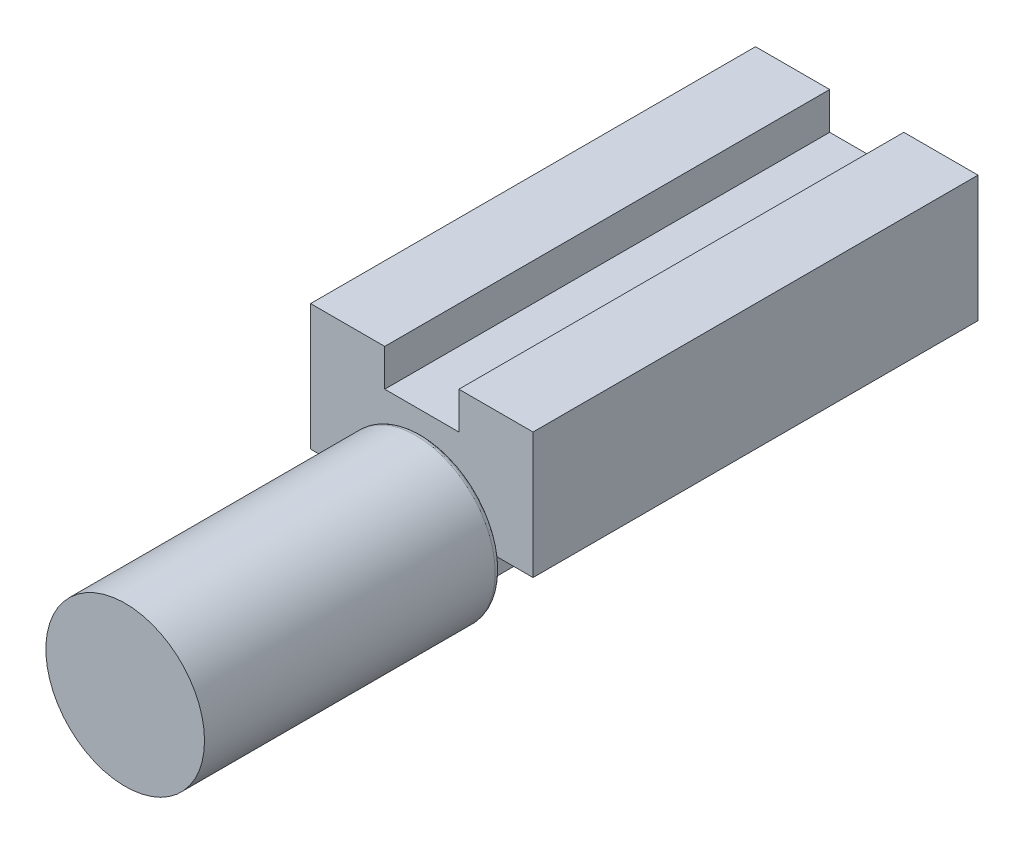
ISO-10303-21;
HEADER;
FILE_DESCRIPTION(('STEP AP214'),'2;1');
FILE_NAME('part.step','',(''),(''),'','','');
FILE_SCHEMA(('AUTOMOTIVE_DESIGN { 1 0 10303 214 1 1 1 1 }'));
ENDSEC;
DATA;
#1=APPLICATION_CONTEXT('core data for automotive mechanical design processes');
#2=APPLICATION_PROTOCOL_DEFINITION('international standard','automotive_design',2000,#1);
#3=PRODUCT_CONTEXT('',#1,'mechanical');
#4=PRODUCT('Part','Part','',(#3));
#5=PRODUCT_RELATED_PRODUCT_CATEGORY('part','',(#4));
#6=PRODUCT_DEFINITION_FORMATION('','',#4);
#7=PRODUCT_DEFINITION_CONTEXT('part definition',#1,'design');
#8=PRODUCT_DEFINITION('design','',#6,#7);
#9=PRODUCT_DEFINITION_SHAPE('','',#8);
#10=(LENGTH_UNIT() NAMED_UNIT(*) SI_UNIT(.MILLI.,.METRE.));
#11=(NAMED_UNIT(*) PLANE_ANGLE_UNIT() SI_UNIT($,.RADIAN.));
#12=(NAMED_UNIT(*) SI_UNIT($,.STERADIAN.) SOLID_ANGLE_UNIT());
#13=UNCERTAINTY_MEASURE_WITH_UNIT(LENGTH_MEASURE(1.E-05),#10,'distance_accuracy_value','');
#14=(GEOMETRIC_REPRESENTATION_CONTEXT(3) GLOBAL_UNCERTAINTY_ASSIGNED_CONTEXT((#13)) GLOBAL_UNIT_ASSIGNED_CONTEXT((#10,
#11,#12)) REPRESENTATION_CONTEXT('',''));
#15=CARTESIAN_POINT('',(0.,0.,0.));
#16=DIRECTION('',(0.,0.,1.));
#17=DIRECTION('',(1.,0.,0.));
#18=AXIS2_PLACEMENT_3D('',#15,#16,#17);
#19=CARTESIAN_POINT('',(-40.9860750000001,-6.15162599999999,25.6413));
#20=DIRECTION('',(0.,0.,1.));
#21=DIRECTION('',(1.,0.,0.));
#22=AXIS2_PLACEMENT_3D('',#19,#20,#21);
#23=PLANE('',#22);
#24=DIRECTION('',(-1.,0.,0.));
#25=VECTOR('',#24,1.);
#26=CARTESIAN_POINT('',(-36.7125250000001,-5.63879999999999,25.6413));
#27=LINE('',#26,#25);
#28=CARTESIAN_POINT('',(-36.7871595606062,-5.63879999999999,25.6413));
#29=VERTEX_POINT('',#28);
#30=CARTESIAN_POINT('',(-45.1849904393939,-5.63879999999999,25.6413));
#31=VERTEX_POINT('',#30);
#32=EDGE_CURVE('E136',#29,#31,#27,.T.);
#33=ORIENTED_EDGE('',*,*,#32,.T.);
#34=CARTESIAN_POINT('',(-40.9860750000001,-6.15162599999999,25.6413));
#35=DIRECTION('',(0.,0.,1.));
#36=DIRECTION('',(1.,0.,0.));
#37=AXIS2_PLACEMENT_3D('',#34,#35,#36);
#38=CIRCLE('',#37,4.230116);
#39=EDGE_CURVE('E157',#31,#29,#38,.F.);
#40=ORIENTED_EDGE('',*,*,#39,.T.);
#41=EDGE_LOOP('',(#33,#40));
#42=FACE_BOUND('',#41,.T.);
#43=ADVANCED_FACE('F60',(#42),#23,.F.);
#44=CARTESIAN_POINT('',(-36.7125250000001,-5.63879999999999,12.82065));
#45=DIRECTION('',(1.,0.,0.));
#46=DIRECTION('',(0.,0.,-1.));
#47=AXIS2_PLACEMENT_3D('',#44,#45,#46);
#48=PLANE('',#47);
#49=DIRECTION('',(0.,0.,1.));
#50=VECTOR('',#49,1.);
#51=CARTESIAN_POINT('',(-36.7125250000001,-5.63879999999999,12.82065));
#52=LINE('',#51,#50);
#53=CARTESIAN_POINT('',(-36.7125250000001,-5.63879999999999,12.82065));
#54=VERTEX_POINT('',#53);
#55=CARTESIAN_POINT('',(-36.7125250000001,-5.63879999999999,25.6494253883431));
#56=VERTEX_POINT('',#55);
#57=EDGE_CURVE('E111',#54,#56,#52,.T.);
#58=ORIENTED_EDGE('',*,*,#57,.T.);
#59=CARTESIAN_POINT('',(-36.7125250000001,-5.63879999999999,25.6494253883431));
#60=CARTESIAN_POINT('',(-36.7125250000001,-5.69577522713636,25.6479450008011));
#61=CARTESIAN_POINT('',(-36.7125250000001,-5.75275822812826,25.6468765231355));
#62=CARTESIAN_POINT('',(-36.7125250000001,-5.86673144202436,25.6453232279782));
#63=CARTESIAN_POINT('',(-36.7125250000001,-5.92372165475941,25.6448383986832));
#64=CARTESIAN_POINT('',(-36.7125250000001,-6.03770612746633,25.6442121844941));
#65=CARTESIAN_POINT('',(-36.7125250000001,-6.0947003874976,25.6440708168729));
#66=CARTESIAN_POINT('',(-36.7125250000001,-6.20868928101538,25.6440696191949));
#67=CARTESIAN_POINT('',(-36.7125250000001,-6.26568391450249,25.6442097899896));
#68=CARTESIAN_POINT('',(-36.7125250000001,-6.35116075014746,25.6446841235827));
#69=CARTESIAN_POINT('',(-36.7125250000001,-6.379643698667,25.6448861678026));
#70=CARTESIAN_POINT('',(-36.7125250000001,-6.43660824210007,25.6454021456277));
#71=CARTESIAN_POINT('',(-36.7125250000001,-6.46508983702641,25.645716077771));
#72=CARTESIAN_POINT('',(-36.7125250000001,-6.52205349929932,25.6464854157013));
#73=CARTESIAN_POINT('',(-36.7125250000001,-6.55053556650011,25.6469408328486));
#74=CARTESIAN_POINT('',(-36.7125250000001,-6.60749664269976,25.6480350717582));
#75=CARTESIAN_POINT('',(-36.7125250000001,-6.63597565163473,25.6486738968039));
#76=CARTESIAN_POINT('',(-36.7125250000001,-6.66445199999999,25.6494253883431));
#77=B_SPLINE_CURVE_WITH_KNOTS('',3,(#59,#60,#61,#62,#63,#64,#65,#66,#67,#68,#69,#70,#71,#72,#73,
#74,#75,#76),.UNSPECIFIED.,.F.,.F.,(4,2,2,2,2,2,2,2,4),(0.,0.170977755097164,0.341952052418938,
0.512934948017678,0.683918360754729,0.76936919951319,0.854818921907787,0.940275507180122,
1.02573362244294),.UNSPECIFIED.);
#78=CARTESIAN_POINT('',(-36.7125250000001,-6.66445199999999,25.6494253883431));
#79=VERTEX_POINT('',#78);
#80=EDGE_CURVE('E161',#56,#79,#77,.T.);
#81=ORIENTED_EDGE('',*,*,#80,.T.);
#82=DIRECTION('',(0.,0.,1.));
#83=VECTOR('',#82,1.);
#84=CARTESIAN_POINT('',(-36.7125250000001,-6.66445199999999,12.82065));
#85=LINE('',#84,#83);
#86=CARTESIAN_POINT('',(-36.7125250000001,-6.66445199999999,12.82065));
#87=VERTEX_POINT('',#86);
#88=EDGE_CURVE('E133',#87,#79,#85,.T.);
#89=ORIENTED_EDGE('',*,*,#88,.F.);
#90=DIRECTION('',(0.,1.,0.));
#91=VECTOR('',#90,1.);
#92=CARTESIAN_POINT('',(-36.7125250000001,-5.63879999999999,12.82065));
#93=LINE('',#92,#91);
#94=EDGE_CURVE('E129',#87,#54,#93,.T.);
#95=ORIENTED_EDGE('',*,*,#94,.T.);
#96=EDGE_LOOP('',(#58,#81,#89,#95));
#97=FACE_BOUND('',#96,.T.);
#98=ADVANCED_FACE('F131',(#97),#48,.T.);
#99=CARTESIAN_POINT('',(-36.7125250000001,-6.66445199999999,12.82065));
#100=DIRECTION('',(0.,-1.,0.));
#101=DIRECTION('',(1.,0.,0.));
#102=AXIS2_PLACEMENT_3D('',#99,#100,#101);
#103=PLANE('',#102);
#104=DIRECTION('',(1.,0.,0.));
#105=VECTOR('',#104,1.);
#106=CARTESIAN_POINT('',(-36.7125250000001,-6.66445199999999,25.6413));
#107=LINE('',#106,#105);
#108=CARTESIAN_POINT('',(-45.1849904393939,-6.66445199999999,25.6413));
#109=VERTEX_POINT('',#108);
#110=CARTESIAN_POINT('',(-36.7871595606062,-6.66445199999999,25.6413));
#111=VERTEX_POINT('',#110);
#112=EDGE_CURVE('E137',#109,#111,#107,.T.);
#113=ORIENTED_EDGE('',*,*,#112,.F.);
#114=CARTESIAN_POINT('',(-45.1849904393939,-6.66445199999999,25.6413));
#115=CARTESIAN_POINT('',(-45.1975765651174,-6.66445199999999,25.6413036451903));
#116=CARTESIAN_POINT('',(-45.2100891724389,-6.66445199999999,25.6419825829838));
#117=CARTESIAN_POINT('',(-45.2349673594156,-6.66445199999999,25.6446910447723));
#118=CARTESIAN_POINT('',(-45.2473329389628,-6.66445199999999,25.6467205697593));
#119=CARTESIAN_POINT('',(-45.2596250000001,-6.66445199999999,25.6494253883417));
#120=B_SPLINE_CURVE_WITH_KNOTS('',3,(#114,#115,#116,#117,#118,#119),.UNSPECIFIED.,.F.,.F.,(4,2,
4),(0.,0.0375930404008896,0.0751861084175852),.UNSPECIFIED.);
#121=CARTESIAN_POINT('',(-45.2596250000001,-6.66445199999999,25.6494253883431));
#122=VERTEX_POINT('',#121);
#123=EDGE_CURVE('E212',#109,#122,#120,.T.);
#124=ORIENTED_EDGE('',*,*,#123,.T.);
#125=DIRECTION('',(0.,0.,1.));
#126=VECTOR('',#125,1.);
#127=CARTESIAN_POINT('',(-45.2596250000001,-6.66445199999999,12.82065));
#128=LINE('',#127,#126);
#129=CARTESIAN_POINT('',(-45.2596250000001,-6.66445199999999,12.82065));
#130=VERTEX_POINT('',#129);
#131=EDGE_CURVE('E84',#130,#122,#128,.T.);
#132=ORIENTED_EDGE('',*,*,#131,.F.);
#133=DIRECTION('',(1.,0.,0.));
#134=VECTOR('',#133,1.);
#135=CARTESIAN_POINT('',(-36.7125250000001,-6.66445199999999,12.82065));
#136=LINE('',#135,#134);
#137=EDGE_CURVE('E123',#130,#87,#136,.T.);
#138=ORIENTED_EDGE('',*,*,#137,.T.);
#139=ORIENTED_EDGE('',*,*,#88,.T.);
#140=CARTESIAN_POINT('',(-36.7125250000001,-6.66445199999999,25.6494253883431));
#141=CARTESIAN_POINT('',(-36.7248170610372,-6.66445199999999,25.6467205697602));
#142=CARTESIAN_POINT('',(-36.7371826405844,-6.66445199999999,25.6446910447727));
#143=CARTESIAN_POINT('',(-36.7620608275611,-6.66445199999999,25.6419825829834));
#144=CARTESIAN_POINT('',(-36.7745734348825,-6.66445199999999,25.6413036451894));
#145=CARTESIAN_POINT('',(-36.787159560606,-6.66445199999999,25.6412999999988));
#146=B_SPLINE_CURVE_WITH_KNOTS('',3,(#140,#141,#142,#143,#144,#145),.UNSPECIFIED.,.F.,.F.,(4,2,
4),(0.,0.0375930680167806,0.0751861084176067),.UNSPECIFIED.);
#147=EDGE_CURVE('E206',#79,#111,#146,.T.);
#148=ORIENTED_EDGE('',*,*,#147,.T.);
#149=EDGE_LOOP('',(#113,#124,#132,#138,#139,#148));
#150=FACE_BOUND('',#149,.T.);
#151=ADVANCED_FACE('F177',(#150),#103,.T.);
#152=CARTESIAN_POINT('',(-45.2596250000001,-5.63879999999999,12.82065));
#153=DIRECTION('',(-1.,0.,0.));
#154=DIRECTION('',(0.,0.,1.));
#155=AXIS2_PLACEMENT_3D('',#152,#153,#154);
#156=PLANE('',#155);
#157=ORIENTED_EDGE('',*,*,#131,.T.);
#158=CARTESIAN_POINT('',(-45.2596250000001,-6.66445199999999,25.6494253883431));
#159=CARTESIAN_POINT('',(-45.2596250000001,-6.60747677286363,25.6479450008011));
#160=CARTESIAN_POINT('',(-45.2596250000001,-6.55049377187173,25.6468765231355));
#161=CARTESIAN_POINT('',(-45.2596250000001,-6.43652055797562,25.6453232279782));
#162=CARTESIAN_POINT('',(-45.2596250000001,-6.37953034524058,25.6448383986832));
#163=CARTESIAN_POINT('',(-45.2596250000001,-6.26554587253366,25.6442121844941));
#164=CARTESIAN_POINT('',(-45.2596250000001,-6.20855161250238,25.6440708168729));
#165=CARTESIAN_POINT('',(-45.2596250000001,-6.09456271898461,25.6440696191949));
#166=CARTESIAN_POINT('',(-45.2596250000001,-6.03756808549749,25.6442097899896));
#167=CARTESIAN_POINT('',(-45.2596250000001,-5.95209124985253,25.6446841235827));
#168=CARTESIAN_POINT('',(-45.2596250000001,-5.92360830133298,25.6448861678026));
#169=CARTESIAN_POINT('',(-45.2596250000001,-5.86664375789992,25.6454021456277));
#170=CARTESIAN_POINT('',(-45.2596250000001,-5.83816216297357,25.645716077771));
#171=CARTESIAN_POINT('',(-45.2596250000001,-5.78119850070066,25.6464854157013));
#172=CARTESIAN_POINT('',(-45.2596250000001,-5.75271643349988,25.6469408328486));
#173=CARTESIAN_POINT('',(-45.2596250000001,-5.69575535730023,25.6480350717582));
#174=CARTESIAN_POINT('',(-45.2596250000001,-5.66727634836525,25.6486738968039));
#175=CARTESIAN_POINT('',(-45.2596250000001,-5.63879999999999,25.6494253883431));
#176=B_SPLINE_CURVE_WITH_KNOTS('',3,(#158,#159,#160,#161,#162,#163,#164,#165,#166,#167,#168,
#169,#170,#171,#172,#173,#174,#175),.UNSPECIFIED.,.F.,.F.,(4,2,2,2,2,2,2,2,4),(0.,
0.170977755097164,0.341952052418937,0.512934948017678,0.683918360754729,0.76936919951319,
0.854818921907787,0.940275507180123,1.02573362244294),.UNSPECIFIED.);
#177=CARTESIAN_POINT('',(-45.2596250000001,-5.63879999999999,25.6494253883431));
#178=VERTEX_POINT('',#177);
#179=EDGE_CURVE('E72',#122,#178,#176,.T.);
#180=ORIENTED_EDGE('',*,*,#179,.T.);
#181=DIRECTION('',(0.,0.,1.));
#182=VECTOR('',#181,1.);
#183=CARTESIAN_POINT('',(-45.2596250000001,-5.63879999999999,12.82065));
#184=LINE('',#183,#182);
#185=CARTESIAN_POINT('',(-45.2596250000001,-5.63879999999999,12.82065));
#186=VERTEX_POINT('',#185);
#187=EDGE_CURVE('E80',#186,#178,#184,.T.);
#188=ORIENTED_EDGE('',*,*,#187,.F.);
#189=DIRECTION('',(0.,-1.,0.));
#190=VECTOR('',#189,1.);
#191=CARTESIAN_POINT('',(-45.2596250000001,-5.63879999999999,12.82065));
#192=LINE('',#191,#190);
#193=EDGE_CURVE('E135',#186,#130,#192,.T.);
#194=ORIENTED_EDGE('',*,*,#193,.T.);
#195=EDGE_LOOP('',(#157,#180,#188,#194));
#196=FACE_BOUND('',#195,.T.);
#197=ADVANCED_FACE('F175',(#196),#156,.T.);
#198=CARTESIAN_POINT('',(-36.7125250000001,-5.63879999999999,12.82065));
#199=DIRECTION('',(0.,1.,0.));
#200=DIRECTION('',(-1.,0.,0.));
#201=AXIS2_PLACEMENT_3D('',#198,#199,#200);
#202=PLANE('',#201);
#203=ORIENTED_EDGE('',*,*,#32,.F.);
#204=CARTESIAN_POINT('',(-36.7871595606062,-5.63879999999999,25.6413));
#205=CARTESIAN_POINT('',(-36.7745734348827,-5.63879999999999,25.6413036451903));
#206=CARTESIAN_POINT('',(-36.7620608275613,-5.63879999999999,25.6419825829838));
#207=CARTESIAN_POINT('',(-36.7371826405845,-5.63879999999999,25.6446910447723));
#208=CARTESIAN_POINT('',(-36.7248170610373,-5.63879999999999,25.6467205697593));
#209=CARTESIAN_POINT('',(-36.7125250000001,-5.63879999999999,25.6494253883417));
#210=B_SPLINE_CURVE_WITH_KNOTS('',3,(#204,#205,#206,#207,#208,#209),.UNSPECIFIED.,.F.,.F.,(4,2,
4),(0.,0.0375930404008896,0.0751861084175852),.UNSPECIFIED.);
#211=EDGE_CURVE('E118',#29,#56,#210,.T.);
#212=ORIENTED_EDGE('',*,*,#211,.T.);
#213=ORIENTED_EDGE('',*,*,#57,.F.);
#214=DIRECTION('',(-1.,0.,0.));
#215=VECTOR('',#214,1.);
#216=CARTESIAN_POINT('',(-36.7125250000001,-5.63879999999999,12.82065));
#217=LINE('',#216,#215);
#218=EDGE_CURVE('E120',#54,#186,#217,.T.);
#219=ORIENTED_EDGE('',*,*,#218,.T.);
#220=ORIENTED_EDGE('',*,*,#187,.T.);
#221=CARTESIAN_POINT('',(-45.2596250000001,-5.63879999999999,25.6494253883431));
#222=CARTESIAN_POINT('',(-45.2473329389629,-5.63879999999999,25.6467205697602));
#223=CARTESIAN_POINT('',(-45.2349673594157,-5.63879999999999,25.6446910447727));
#224=CARTESIAN_POINT('',(-45.2100891724391,-5.63879999999999,25.6419825829834));
#225=CARTESIAN_POINT('',(-45.1975765651176,-5.63879999999999,25.6413036451894));
#226=CARTESIAN_POINT('',(-45.1849904393942,-5.63879999999999,25.6412999999988));
#227=B_SPLINE_CURVE_WITH_KNOTS('',3,(#221,#222,#223,#224,#225,#226),.UNSPECIFIED.,.F.,.F.,(4,2,
4),(0.,0.0375930680167806,0.0751861084176067),.UNSPECIFIED.);
#228=EDGE_CURVE('E12',#178,#31,#227,.T.);
#229=ORIENTED_EDGE('',*,*,#228,.T.);
#230=EDGE_LOOP('',(#203,#212,#213,#219,#220,#229));
#231=FACE_BOUND('',#230,.T.);
#232=ADVANCED_FACE('F116',(#231),#202,.T.);
#233=CARTESIAN_POINT('',(0.,0.,12.82065));
#234=DIRECTION('',(0.,0.,-1.));
#235=DIRECTION('',(-1.,0.,0.));
#236=AXIS2_PLACEMENT_3D('',#233,#234,#235);
#237=PLANE('',#236);
#238=ORIENTED_EDGE('',*,*,#94,.F.);
#239=ORIENTED_EDGE('',*,*,#137,.F.);
#240=ORIENTED_EDGE('',*,*,#193,.F.);
#241=ORIENTED_EDGE('',*,*,#218,.F.);
#242=EDGE_LOOP('',(#238,#239,#240,#241));
#243=FACE_BOUND('',#242,.T.);
#244=ADVANCED_FACE('F127',(#243),#237,.T.);
#245=ORIENTED_EDGE('',*,*,#112,.T.);
#246=CARTESIAN_POINT('',(-40.9860750000001,-6.15162599999999,25.6413));
#247=DIRECTION('',(0.,0.,1.));
#248=DIRECTION('',(1.,0.,0.));
#249=AXIS2_PLACEMENT_3D('',#246,#247,#248);
#250=CIRCLE('',#249,4.230116);
#251=EDGE_CURVE('E152',#111,#109,#250,.F.);
#252=ORIENTED_EDGE('',*,*,#251,.T.);
#253=EDGE_LOOP('',(#245,#252));
#254=FACE_BOUND('',#253,.T.);
#255=ADVANCED_FACE('F186',(#254),#23,.F.);
#256=CARTESIAN_POINT('',(-40.9860750000001,-6.15162599999999,42.7355));
#257=DIRECTION('',(0.,0.,-1.));
#258=DIRECTION('',(-1.,0.,0.));
#259=AXIS2_PLACEMENT_3D('',#256,#257,#258);
#260=CYLINDRICAL_SURFACE('',#259,4.572);
#261=CARTESIAN_POINT('',(-40.9860750000001,-6.15162599999999,25.983184));
#262=DIRECTION('',(0.,0.,1.));
#263=DIRECTION('',(1.,0.,0.));
#264=AXIS2_PLACEMENT_3D('',#261,#262,#263);
#265=CIRCLE('',#264,4.572);
#266=CARTESIAN_POINT('',(-36.4140750000001,-6.15162599999999,25.983184));
#267=VERTEX_POINT('',#266);
#268=EDGE_CURVE('E146',#267,#267,#265,.T.);
#269=ORIENTED_EDGE('',*,*,#268,.T.);
#270=EDGE_LOOP('',(#269));
#271=FACE_BOUND('',#270,.T.);
#272=CARTESIAN_POINT('',(-40.9860750000001,-6.15162599999999,42.7355));
#273=DIRECTION('',(0.,0.,1.));
#274=DIRECTION('',(1.,0.,0.));
#275=AXIS2_PLACEMENT_3D('',#272,#273,#274);
#276=CIRCLE('',#275,4.572);
#277=CARTESIAN_POINT('',(-36.4140750000001,-6.15162599999999,42.7355));
#278=VERTEX_POINT('',#277);
#279=EDGE_CURVE('E141',#278,#278,#276,.T.);
#280=ORIENTED_EDGE('',*,*,#279,.F.);
#281=EDGE_LOOP('',(#280));
#282=FACE_BOUND('',#281,.T.);
#283=ADVANCED_FACE('F193',(#271,#282),#260,.T.);
#284=CARTESIAN_POINT('',(-40.9860750000001,-6.15162599999999,42.7355));
#285=DIRECTION('',(0.,0.,1.));
#286=DIRECTION('',(1.,0.,0.));
#287=AXIS2_PLACEMENT_3D('',#284,#285,#286);
#288=PLANE('',#287);
#289=ORIENTED_EDGE('',*,*,#279,.T.);
#290=EDGE_LOOP('',(#289));
#291=FACE_BOUND('',#290,.T.);
#292=ADVANCED_FACE('F197',(#291),#288,.T.);
#293=CARTESIAN_POINT('',(-40.9860750000001,-6.15162599999999,25.983184));
#294=DIRECTION('',(0.,0.,1.));
#295=DIRECTION('',(1.,0.,0.));
#296=AXIS2_PLACEMENT_3D('',#293,#294,#295);
#297=TOROIDAL_SURFACE('',#296,4.230116,0.341884);
#298=ORIENTED_EDGE('',*,*,#211,.F.);
#299=ORIENTED_EDGE('',*,*,#39,.F.);
#300=ORIENTED_EDGE('',*,*,#228,.F.);
#301=ORIENTED_EDGE('',*,*,#179,.F.);
#302=ORIENTED_EDGE('',*,*,#123,.F.);
#303=ORIENTED_EDGE('',*,*,#251,.F.);
#304=ORIENTED_EDGE('',*,*,#147,.F.);
#305=ORIENTED_EDGE('',*,*,#80,.F.);
#306=EDGE_LOOP('',(#298,#299,#300,#301,#302,#303,#304,#305));
#307=FACE_BOUND('',#306,.T.);
#308=ORIENTED_EDGE('',*,*,#268,.F.);
#309=EDGE_LOOP('',(#308));
#310=FACE_BOUND('',#309,.T.);
#311=ADVANCED_FACE('F56',(#307,#310),#297,.T.);
#312=CLOSED_SHELL('',(#43,#98,#151,#197,#232,#244,#255,#283,#292,#311));
#313=MANIFOLD_SOLID_BREP('B2',#312);
#314=CARTESIAN_POINT('',(-47.3964000000001,-5.63879999999999,25.6413));
#315=DIRECTION('',(0.,1.,0.));
#316=DIRECTION('',(0.,0.,1.));
#317=AXIS2_PLACEMENT_3D('',#314,#315,#316);
#318=PLANE('',#317);
#319=DIRECTION('',(1.,0.,0.));
#320=VECTOR('',#319,1.);
#321=CARTESIAN_POINT('',(-47.3964000000001,-5.63879999999999,0.));
#322=LINE('',#321,#320);
#323=CARTESIAN_POINT('',(-47.3964000000001,-5.63879999999999,0.));
#324=VERTEX_POINT('',#323);
#325=CARTESIAN_POINT('',(-34.5757500000001,-5.63879999999999,0.));
#326=VERTEX_POINT('',#325);
#327=EDGE_CURVE('E401',#324,#326,#322,.T.);
#328=ORIENTED_EDGE('',*,*,#327,.T.);
#329=DIRECTION('',(0.,0.,-1.));
#330=VECTOR('',#329,1.);
#331=CARTESIAN_POINT('',(-34.5757500000001,-5.63879999999999,25.6413));
#332=LINE('',#331,#330);
#333=CARTESIAN_POINT('',(-34.5757500000001,-5.63879999999999,25.6413));
#334=VERTEX_POINT('',#333);
#335=EDGE_CURVE('E312',#334,#326,#332,.T.);
#336=ORIENTED_EDGE('',*,*,#335,.F.);
#337=DIRECTION('',(1.,0.,0.));
#338=VECTOR('',#337,1.);
#339=CARTESIAN_POINT('',(-47.3964000000001,-5.63879999999999,25.6413));
#340=LINE('',#339,#338);
#341=CARTESIAN_POINT('',(-47.3964000000001,-5.63879999999999,25.6413));
#342=VERTEX_POINT('',#341);
#343=EDGE_CURVE('E364',#342,#334,#340,.T.);
#344=ORIENTED_EDGE('',*,*,#343,.F.);
#345=DIRECTION('',(0.,0.,-1.));
#346=VECTOR('',#345,1.);
#347=CARTESIAN_POINT('',(-47.3964000000001,-5.63879999999999,25.6413));
#348=LINE('',#347,#346);
#349=EDGE_CURVE('E54',#342,#324,#348,.T.);
#350=ORIENTED_EDGE('',*,*,#349,.T.);
#351=EDGE_LOOP('',(#328,#336,#344,#350));
#352=FACE_BOUND('',#351,.T.);
#353=ADVANCED_FACE('F301',(#352),#318,.F.);
#354=CARTESIAN_POINT('',(-34.5757500000001,1.62623500000001,25.6413));
#355=DIRECTION('',(-1.,0.,0.));
#356=DIRECTION('',(0.,0.,1.));
#357=AXIS2_PLACEMENT_3D('',#354,#355,#356);
#358=PLANE('',#357);
#359=DIRECTION('',(0.,1.,0.));
#360=VECTOR('',#359,1.);
#361=CARTESIAN_POINT('',(-34.5757500000001,1.62623500000001,0.));
#362=LINE('',#361,#360);
#363=CARTESIAN_POINT('',(-34.5757500000001,1.62623500000001,0.));
#364=VERTEX_POINT('',#363);
#365=EDGE_CURVE('E404',#326,#364,#362,.T.);
#366=ORIENTED_EDGE('',*,*,#365,.T.);
#367=DIRECTION('',(0.,0.,-1.));
#368=VECTOR('',#367,1.);
#369=CARTESIAN_POINT('',(-34.5757500000001,1.62623500000001,25.6413));
#370=LINE('',#369,#368);
#371=CARTESIAN_POINT('',(-34.5757500000001,1.62623500000001,25.6413));
#372=VERTEX_POINT('',#371);
#373=EDGE_CURVE('E425',#372,#364,#370,.T.);
#374=ORIENTED_EDGE('',*,*,#373,.F.);
#375=DIRECTION('',(0.,1.,0.));
#376=VECTOR('',#375,1.);
#377=CARTESIAN_POINT('',(-34.5757500000001,1.62623500000001,25.6413));
#378=LINE('',#377,#376);
#379=EDGE_CURVE('E429',#334,#372,#378,.T.);
#380=ORIENTED_EDGE('',*,*,#379,.F.);
#381=ORIENTED_EDGE('',*,*,#335,.T.);
#382=EDGE_LOOP('',(#366,#374,#380,#381));
#383=FACE_BOUND('',#382,.T.);
#384=ADVANCED_FACE('F427',(#383),#358,.F.);
#385=CARTESIAN_POINT('',(-38.8493000000001,1.62623500000001,25.6413));
#386=DIRECTION('',(0.,-1.,0.));
#387=DIRECTION('',(0.,0.,-1.));
#388=AXIS2_PLACEMENT_3D('',#385,#386,#387);
#389=PLANE('',#388);
#390=DIRECTION('',(-1.,0.,0.));
#391=VECTOR('',#390,1.);
#392=CARTESIAN_POINT('',(-38.8493000000001,1.62623500000001,0.));
#393=LINE('',#392,#391);
#394=CARTESIAN_POINT('',(-38.8493000000001,1.62623500000001,0.));
#395=VERTEX_POINT('',#394);
#396=EDGE_CURVE('E407',#364,#395,#393,.T.);
#397=ORIENTED_EDGE('',*,*,#396,.T.);
#398=DIRECTION('',(0.,0.,-1.));
#399=VECTOR('',#398,1.);
#400=CARTESIAN_POINT('',(-38.8493000000001,1.62623500000001,25.6413));
#401=LINE('',#400,#399);
#402=CARTESIAN_POINT('',(-38.8493000000001,1.62623500000001,25.6413));
#403=VERTEX_POINT('',#402);
#404=EDGE_CURVE('E417',#403,#395,#401,.T.);
#405=ORIENTED_EDGE('',*,*,#404,.F.);
#406=DIRECTION('',(-1.,0.,0.));
#407=VECTOR('',#406,1.);
#408=CARTESIAN_POINT('',(-38.8493000000001,1.62623500000001,25.6413));
#409=LINE('',#408,#407);
#410=EDGE_CURVE('E445',#372,#403,#409,.T.);
#411=ORIENTED_EDGE('',*,*,#410,.F.);
#412=ORIENTED_EDGE('',*,*,#373,.T.);
#413=EDGE_LOOP('',(#397,#405,#411,#412));
#414=FACE_BOUND('',#413,.T.);
#415=ADVANCED_FACE('F436',(#414),#389,.F.);
#416=CARTESIAN_POINT('',(-38.8493000000001,-0.510539999999992,25.6413));
#417=DIRECTION('',(1.,0.,0.));
#418=DIRECTION('',(0.,0.,-1.));
#419=AXIS2_PLACEMENT_3D('',#416,#417,#418);
#420=PLANE('',#419);
#421=DIRECTION('',(0.,-1.,0.));
#422=VECTOR('',#421,1.);
#423=CARTESIAN_POINT('',(-38.8493000000001,-0.510539999999992,0.));
#424=LINE('',#423,#422);
#425=CARTESIAN_POINT('',(-38.8493000000001,-0.510539999999992,0.));
#426=VERTEX_POINT('',#425);
#427=EDGE_CURVE('E410',#395,#426,#424,.T.);
#428=ORIENTED_EDGE('',*,*,#427,.T.);
#429=DIRECTION('',(0.,0.,-1.));
#430=VECTOR('',#429,1.);
#431=CARTESIAN_POINT('',(-38.8493000000001,-0.510539999999992,25.6413));
#432=LINE('',#431,#430);
#433=CARTESIAN_POINT('',(-38.8493000000001,-0.510539999999992,25.6413));
#434=VERTEX_POINT('',#433);
#435=EDGE_CURVE('E391',#434,#426,#432,.T.);
#436=ORIENTED_EDGE('',*,*,#435,.F.);
#437=DIRECTION('',(0.,-1.,0.));
#438=VECTOR('',#437,1.);
#439=CARTESIAN_POINT('',(-38.8493000000001,-0.510539999999992,25.6413));
#440=LINE('',#439,#438);
#441=EDGE_CURVE('E381',#403,#434,#440,.T.);
#442=ORIENTED_EDGE('',*,*,#441,.F.);
#443=ORIENTED_EDGE('',*,*,#404,.T.);
#444=EDGE_LOOP('',(#428,#436,#442,#443));
#445=FACE_BOUND('',#444,.T.);
#446=ADVANCED_FACE('F441',(#445),#420,.F.);
#447=CARTESIAN_POINT('',(-43.1228500000001,-0.510539999999992,25.6413));
#448=DIRECTION('',(0.,-1.,0.));
#449=DIRECTION('',(0.,0.,-1.));
#450=AXIS2_PLACEMENT_3D('',#447,#448,#449);
#451=PLANE('',#450);
#452=DIRECTION('',(-1.,0.,0.));
#453=VECTOR('',#452,1.);
#454=CARTESIAN_POINT('',(-43.1228500000001,-0.510539999999992,0.));
#455=LINE('',#454,#453);
#456=CARTESIAN_POINT('',(-43.1228500000001,-0.510539999999992,0.));
#457=VERTEX_POINT('',#456);
#458=EDGE_CURVE('E394',#426,#457,#455,.T.);
#459=ORIENTED_EDGE('',*,*,#458,.T.);
#460=DIRECTION('',(0.,0.,-1.));
#461=VECTOR('',#460,1.);
#462=CARTESIAN_POINT('',(-43.1228500000001,-0.510539999999992,25.6413));
#463=LINE('',#462,#461);
#464=CARTESIAN_POINT('',(-43.1228500000001,-0.510539999999992,25.6413));
#465=VERTEX_POINT('',#464);
#466=EDGE_CURVE('E389',#465,#457,#463,.T.);
#467=ORIENTED_EDGE('',*,*,#466,.F.);
#468=DIRECTION('',(-1.,0.,0.));
#469=VECTOR('',#468,1.);
#470=CARTESIAN_POINT('',(-43.1228500000001,-0.510539999999992,25.6413));
#471=LINE('',#470,#469);
#472=EDGE_CURVE('E380',#434,#465,#471,.T.);
#473=ORIENTED_EDGE('',*,*,#472,.F.);
#474=ORIENTED_EDGE('',*,*,#435,.T.);
#475=EDGE_LOOP('',(#459,#467,#473,#474));
#476=FACE_BOUND('',#475,.T.);
#477=ADVANCED_FACE('F386',(#476),#451,.F.);
#478=CARTESIAN_POINT('',(-43.1228500000001,-0.510539999999992,25.6413));
#479=DIRECTION('',(-1.,0.,0.));
#480=DIRECTION('',(0.,0.,1.));
#481=AXIS2_PLACEMENT_3D('',#478,#479,#480);
#482=PLANE('',#481);
#483=DIRECTION('',(0.,1.,0.));
#484=VECTOR('',#483,1.);
#485=CARTESIAN_POINT('',(-43.1228500000001,-0.510539999999992,0.));
#486=LINE('',#485,#484);
#487=CARTESIAN_POINT('',(-43.1228500000001,1.62623500000001,0.));
#488=VERTEX_POINT('',#487);
#489=EDGE_CURVE('E347',#457,#488,#486,.T.);
#490=ORIENTED_EDGE('',*,*,#489,.T.);
#491=DIRECTION('',(0.,0.,-1.));
#492=VECTOR('',#491,1.);
#493=CARTESIAN_POINT('',(-43.1228500000001,1.62623500000001,25.6413));
#494=LINE('',#493,#492);
#495=CARTESIAN_POINT('',(-43.1228500000001,1.62623500000001,25.6413));
#496=VERTEX_POINT('',#495);
#497=EDGE_CURVE('E395',#496,#488,#494,.T.);
#498=ORIENTED_EDGE('',*,*,#497,.F.);
#499=DIRECTION('',(0.,1.,0.));
#500=VECTOR('',#499,1.);
#501=CARTESIAN_POINT('',(-43.1228500000001,-0.510539999999992,25.6413));
#502=LINE('',#501,#500);
#503=EDGE_CURVE('E382',#465,#496,#502,.T.);
#504=ORIENTED_EDGE('',*,*,#503,.F.);
#505=ORIENTED_EDGE('',*,*,#466,.T.);
#506=EDGE_LOOP('',(#490,#498,#504,#505));
#507=FACE_BOUND('',#506,.T.);
#508=ADVANCED_FACE('F392',(#507),#482,.F.);
#509=CARTESIAN_POINT('',(-47.3964000000001,1.62623500000001,25.6413));
#510=DIRECTION('',(0.,-1.,0.));
#511=DIRECTION('',(0.,0.,-1.));
#512=AXIS2_PLACEMENT_3D('',#509,#510,#511);
#513=PLANE('',#512);
#514=DIRECTION('',(-1.,0.,0.));
#515=VECTOR('',#514,1.);
#516=CARTESIAN_POINT('',(-47.3964000000001,1.62623500000001,0.));
#517=LINE('',#516,#515);
#518=CARTESIAN_POINT('',(-47.3964000000001,1.62623500000001,0.));
#519=VERTEX_POINT('',#518);
#520=EDGE_CURVE('E357',#488,#519,#517,.T.);
#521=ORIENTED_EDGE('',*,*,#520,.T.);
#522=DIRECTION('',(0.,0.,-1.));
#523=VECTOR('',#522,1.);
#524=CARTESIAN_POINT('',(-47.3964000000001,1.62623500000001,25.6413));
#525=LINE('',#524,#523);
#526=CARTESIAN_POINT('',(-47.3964000000001,1.62623500000001,25.6413));
#527=VERTEX_POINT('',#526);
#528=EDGE_CURVE('E396',#527,#519,#525,.T.);
#529=ORIENTED_EDGE('',*,*,#528,.F.);
#530=DIRECTION('',(-1.,0.,0.));
#531=VECTOR('',#530,1.);
#532=CARTESIAN_POINT('',(-47.3964000000001,1.62623500000001,25.6413));
#533=LINE('',#532,#531);
#534=EDGE_CURVE('E399',#496,#527,#533,.T.);
#535=ORIENTED_EDGE('',*,*,#534,.F.);
#536=ORIENTED_EDGE('',*,*,#497,.T.);
#537=EDGE_LOOP('',(#521,#529,#535,#536));
#538=FACE_BOUND('',#537,.T.);
#539=ADVANCED_FACE('F464',(#538),#513,.F.);
#540=CARTESIAN_POINT('',(-47.3964000000001,-0.510539999999992,25.6413));
#541=DIRECTION('',(1.,0.,0.));
#542=DIRECTION('',(0.,0.,-1.));
#543=AXIS2_PLACEMENT_3D('',#540,#541,#542);
#544=PLANE('',#543);
#545=DIRECTION('',(0.,-1.,0.));
#546=VECTOR('',#545,1.);
#547=CARTESIAN_POINT('',(-47.3964000000001,-0.510539999999992,0.));
#548=LINE('',#547,#546);
#549=EDGE_CURVE('E414',#519,#324,#548,.T.);
#550=ORIENTED_EDGE('',*,*,#549,.T.);
#551=ORIENTED_EDGE('',*,*,#349,.F.);
#552=DIRECTION('',(0.,-1.,0.));
#553=VECTOR('',#552,1.);
#554=CARTESIAN_POINT('',(-47.3964000000001,-5.63879999999999,25.6413));
#555=LINE('',#554,#553);
#556=EDGE_CURVE('E318',#527,#342,#555,.T.);
#557=ORIENTED_EDGE('',*,*,#556,.F.);
#558=ORIENTED_EDGE('',*,*,#528,.T.);
#559=EDGE_LOOP('',(#550,#551,#557,#558));
#560=FACE_BOUND('',#559,.T.);
#561=ADVANCED_FACE('F450',(#560),#544,.F.);
#562=CARTESIAN_POINT('',(0.,0.,25.6413));
#563=DIRECTION('',(0.,0.,-1.));
#564=DIRECTION('',(-1.,0.,0.));
#565=AXIS2_PLACEMENT_3D('',#562,#563,#564);
#566=PLANE('',#565);
#567=ORIENTED_EDGE('',*,*,#556,.T.);
#568=ORIENTED_EDGE('',*,*,#343,.T.);
#569=ORIENTED_EDGE('',*,*,#379,.T.);
#570=ORIENTED_EDGE('',*,*,#410,.T.);
#571=ORIENTED_EDGE('',*,*,#441,.T.);
#572=ORIENTED_EDGE('',*,*,#472,.T.);
#573=ORIENTED_EDGE('',*,*,#503,.T.);
#574=ORIENTED_EDGE('',*,*,#534,.T.);
#575=EDGE_LOOP('',(#567,#568,#569,#570,#571,#572,#573,#574));
#576=FACE_BOUND('',#575,.T.);
#577=ADVANCED_FACE('F377',(#576),#566,.F.);
#578=CARTESIAN_POINT('',(0.,0.,0.));
#579=DIRECTION('',(0.,0.,-1.));
#580=DIRECTION('',(-1.,0.,0.));
#581=AXIS2_PLACEMENT_3D('',#578,#579,#580);
#582=PLANE('',#581);
#583=ORIENTED_EDGE('',*,*,#327,.F.);
#584=ORIENTED_EDGE('',*,*,#549,.F.);
#585=ORIENTED_EDGE('',*,*,#520,.F.);
#586=ORIENTED_EDGE('',*,*,#489,.F.);
#587=ORIENTED_EDGE('',*,*,#458,.F.);
#588=ORIENTED_EDGE('',*,*,#427,.F.);
#589=ORIENTED_EDGE('',*,*,#396,.F.);
#590=ORIENTED_EDGE('',*,*,#365,.F.);
#591=EDGE_LOOP('',(#583,#584,#585,#586,#587,#588,#589,#590));
#592=FACE_BOUND('',#591,.T.);
#593=ADVANCED_FACE('F431',(#592),#582,.T.);
#594=CLOSED_SHELL('',(#353,#384,#415,#446,#477,#508,#539,#561,#577,#593));
#595=MANIFOLD_SOLID_BREP('B6',#594);
#596=ADVANCED_BREP_SHAPE_REPRESENTATION('',(#18,#313,#595),#14);
#597=SHAPE_DEFINITION_REPRESENTATION(#9,#596);
ENDSEC;
END-ISO-10303-21;
